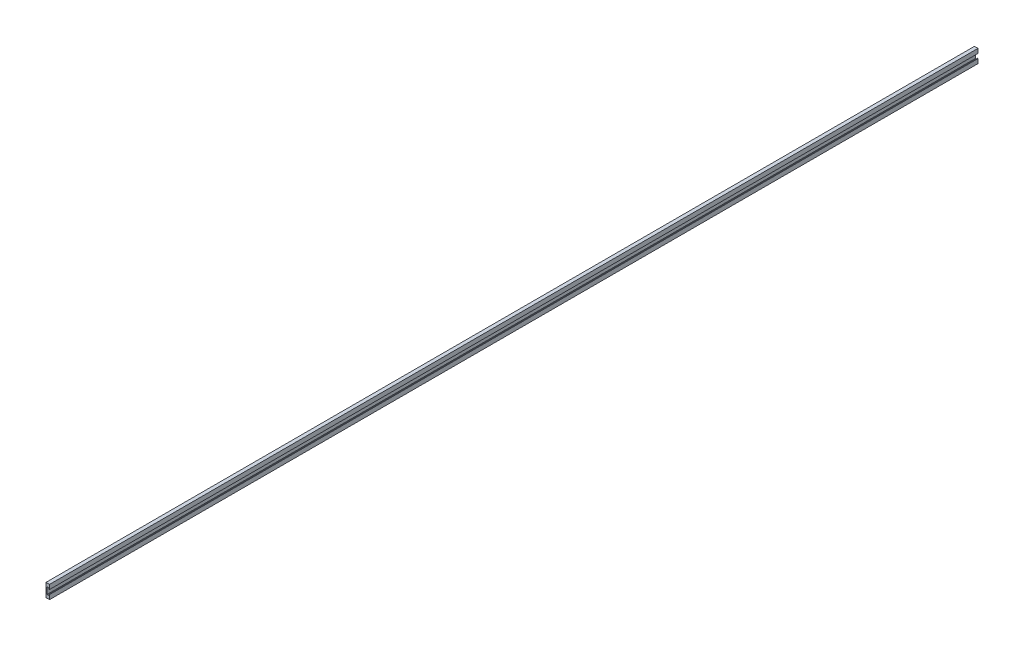
ISO-10303-21;
HEADER;
FILE_DESCRIPTION(('STEP AP214'),'2;1');
FILE_NAME('part.step','',(''),(''),'','','');
FILE_SCHEMA(('AUTOMOTIVE_DESIGN { 1 0 10303 214 1 1 1 1 }'));
ENDSEC;
DATA;
#1=APPLICATION_CONTEXT('core data for automotive mechanical design processes');
#2=APPLICATION_PROTOCOL_DEFINITION('international standard','automotive_design',2000,#1);
#3=PRODUCT_CONTEXT('',#1,'mechanical');
#4=PRODUCT('Part','Part','',(#3));
#5=PRODUCT_RELATED_PRODUCT_CATEGORY('part','',(#4));
#6=PRODUCT_DEFINITION_FORMATION('','',#4);
#7=PRODUCT_DEFINITION_CONTEXT('part definition',#1,'design');
#8=PRODUCT_DEFINITION('design','',#6,#7);
#9=PRODUCT_DEFINITION_SHAPE('','',#8);
#10=(LENGTH_UNIT() NAMED_UNIT(*) SI_UNIT(.MILLI.,.METRE.));
#11=(NAMED_UNIT(*) PLANE_ANGLE_UNIT() SI_UNIT($,.RADIAN.));
#12=(NAMED_UNIT(*) SI_UNIT($,.STERADIAN.) SOLID_ANGLE_UNIT());
#13=UNCERTAINTY_MEASURE_WITH_UNIT(LENGTH_MEASURE(1.E-05),#10,'distance_accuracy_value','');
#14=(GEOMETRIC_REPRESENTATION_CONTEXT(3) GLOBAL_UNCERTAINTY_ASSIGNED_CONTEXT((#13)) GLOBAL_UNIT_ASSIGNED_CONTEXT((#10,
#11,#12)) REPRESENTATION_CONTEXT('',''));
#15=CARTESIAN_POINT('',(0.,0.,0.));
#16=DIRECTION('',(0.,0.,1.));
#17=DIRECTION('',(1.,0.,0.));
#18=AXIS2_PLACEMENT_3D('',#15,#16,#17);
#19=CARTESIAN_POINT('',(0.,7.5,1050.));
#20=DIRECTION('',(-1.,0.,0.));
#21=DIRECTION('',(0.,-1.,0.));
#22=AXIS2_PLACEMENT_3D('',#19,#20,#21);
#23=PLANE('',#22);
#24=DIRECTION('',(0.,1.,0.));
#25=VECTOR('',#24,1.);
#26=CARTESIAN_POINT('',(0.,7.5,-1050.));
#27=LINE('',#26,#25);
#28=CARTESIAN_POINT('',(0.,0.,-1050.));
#29=VERTEX_POINT('',#28);
#30=CARTESIAN_POINT('',(0.,10.,-1050.));
#31=VERTEX_POINT('',#30);
#32=EDGE_CURVE('E97',#29,#31,#27,.T.);
#33=ORIENTED_EDGE('',*,*,#32,.T.);
#34=DIRECTION('',(0.,0.,-1.));
#35=VECTOR('',#34,1.);
#36=CARTESIAN_POINT('',(0.,10.,1050.));
#37=LINE('',#36,#35);
#38=CARTESIAN_POINT('',(0.,10.,1050.));
#39=VERTEX_POINT('',#38);
#40=EDGE_CURVE('E11',#39,#31,#37,.T.);
#41=ORIENTED_EDGE('',*,*,#40,.F.);
#42=DIRECTION('',(0.,1.,0.));
#43=VECTOR('',#42,1.);
#44=CARTESIAN_POINT('',(0.,7.5,1050.));
#45=LINE('',#44,#43);
#46=CARTESIAN_POINT('',(0.,0.,1050.));
#47=VERTEX_POINT('',#46);
#48=EDGE_CURVE('E103',#47,#39,#45,.T.);
#49=ORIENTED_EDGE('',*,*,#48,.F.);
#50=DIRECTION('',(0.,0.,-1.));
#51=VECTOR('',#50,1.);
#52=CARTESIAN_POINT('',(0.,0.,1050.));
#53=LINE('',#52,#51);
#54=EDGE_CURVE('E149',#47,#29,#53,.T.);
#55=ORIENTED_EDGE('',*,*,#54,.T.);
#56=EDGE_LOOP('',(#33,#41,#49,#55));
#57=FACE_BOUND('',#56,.T.);
#58=ADVANCED_FACE('F33',(#57),#23,.F.);
#59=CARTESIAN_POINT('',(0.,10.,1050.));
#60=DIRECTION('',(0.,-1.,0.));
#61=DIRECTION('',(0.,0.,-1.));
#62=AXIS2_PLACEMENT_3D('',#59,#60,#61);
#63=PLANE('',#62);
#64=DIRECTION('',(-1.,0.,0.));
#65=VECTOR('',#64,1.);
#66=CARTESIAN_POINT('',(0.,10.,-1050.));
#67=LINE('',#66,#65);
#68=CARTESIAN_POINT('',(-1.5,10.,-1050.));
#69=VERTEX_POINT('',#68);
#70=EDGE_CURVE('E154',#31,#69,#67,.T.);
#71=ORIENTED_EDGE('',*,*,#70,.T.);
#72=DIRECTION('',(0.,0.,-1.));
#73=VECTOR('',#72,1.);
#74=CARTESIAN_POINT('',(-1.5,10.,1050.));
#75=LINE('',#74,#73);
#76=CARTESIAN_POINT('',(-1.5,10.,1050.));
#77=VERTEX_POINT('',#76);
#78=EDGE_CURVE('E41',#77,#69,#75,.T.);
#79=ORIENTED_EDGE('',*,*,#78,.F.);
#80=DIRECTION('',(-1.,0.,0.));
#81=VECTOR('',#80,1.);
#82=CARTESIAN_POINT('',(0.,10.,1050.));
#83=LINE('',#82,#81);
#84=EDGE_CURVE('E242',#39,#77,#83,.T.);
#85=ORIENTED_EDGE('',*,*,#84,.F.);
#86=ORIENTED_EDGE('',*,*,#40,.T.);
#87=EDGE_LOOP('',(#71,#79,#85,#86));
#88=FACE_BOUND('',#87,.T.);
#89=ADVANCED_FACE('F245',(#88),#63,.F.);
#90=CARTESIAN_POINT('',(-1.5,10.,1050.));
#91=DIRECTION('',(1.,0.,0.));
#92=DIRECTION('',(0.,0.,-1.));
#93=AXIS2_PLACEMENT_3D('',#90,#91,#92);
#94=PLANE('',#93);
#95=DIRECTION('',(0.,-1.,0.));
#96=VECTOR('',#95,1.);
#97=CARTESIAN_POINT('',(-1.5,10.,-1050.));
#98=LINE('',#97,#96);
#99=CARTESIAN_POINT('',(-1.5,7.5,-1050.));
#100=VERTEX_POINT('',#99);
#101=EDGE_CURVE('E156',#69,#100,#98,.T.);
#102=ORIENTED_EDGE('',*,*,#101,.T.);
#103=DIRECTION('',(0.,0.,-1.));
#104=VECTOR('',#103,1.);
#105=CARTESIAN_POINT('',(-1.5,7.5,1050.));
#106=LINE('',#105,#104);
#107=CARTESIAN_POINT('',(-1.5,7.5,1050.));
#108=VERTEX_POINT('',#107);
#109=EDGE_CURVE('E194',#108,#100,#106,.T.);
#110=ORIENTED_EDGE('',*,*,#109,.F.);
#111=DIRECTION('',(0.,-1.,0.));
#112=VECTOR('',#111,1.);
#113=CARTESIAN_POINT('',(-1.5,10.,1050.));
#114=LINE('',#113,#112);
#115=EDGE_CURVE('E203',#77,#108,#114,.T.);
#116=ORIENTED_EDGE('',*,*,#115,.F.);
#117=ORIENTED_EDGE('',*,*,#78,.T.);
#118=EDGE_LOOP('',(#102,#110,#116,#117));
#119=FACE_BOUND('',#118,.T.);
#120=ADVANCED_FACE('F201',(#119),#94,.F.);
#121=CARTESIAN_POINT('',(-5.5,7.5,1050.));
#122=DIRECTION('',(0.,-1.,0.));
#123=DIRECTION('',(0.,0.,-1.));
#124=AXIS2_PLACEMENT_3D('',#121,#122,#123);
#125=PLANE('',#124);
#126=DIRECTION('',(-1.,0.,0.));
#127=VECTOR('',#126,1.);
#128=CARTESIAN_POINT('',(-5.5,7.5,-1050.));
#129=LINE('',#128,#127);
#130=CARTESIAN_POINT('',(-5.5,7.5,-1050.));
#131=VERTEX_POINT('',#130);
#132=EDGE_CURVE('E158',#100,#131,#129,.T.);
#133=ORIENTED_EDGE('',*,*,#132,.T.);
#134=DIRECTION('',(0.,0.,-1.));
#135=VECTOR('',#134,1.);
#136=CARTESIAN_POINT('',(-5.5,7.5,1050.));
#137=LINE('',#136,#135);
#138=CARTESIAN_POINT('',(-5.5,7.5,1050.));
#139=VERTEX_POINT('',#138);
#140=EDGE_CURVE('E191',#139,#131,#137,.T.);
#141=ORIENTED_EDGE('',*,*,#140,.F.);
#142=DIRECTION('',(-1.,0.,0.));
#143=VECTOR('',#142,1.);
#144=CARTESIAN_POINT('',(-5.5,7.5,1050.));
#145=LINE('',#144,#143);
#146=EDGE_CURVE('E221',#108,#139,#145,.T.);
#147=ORIENTED_EDGE('',*,*,#146,.F.);
#148=ORIENTED_EDGE('',*,*,#109,.T.);
#149=EDGE_LOOP('',(#133,#141,#147,#148));
#150=FACE_BOUND('',#149,.T.);
#151=ADVANCED_FACE('F212',(#150),#125,.F.);
#152=CARTESIAN_POINT('',(-5.5,22.5,1050.));
#153=DIRECTION('',(-1.,0.,0.));
#154=DIRECTION('',(0.,0.,1.));
#155=AXIS2_PLACEMENT_3D('',#152,#153,#154);
#156=PLANE('',#155);
#157=DIRECTION('',(0.,1.,0.));
#158=VECTOR('',#157,1.);
#159=CARTESIAN_POINT('',(-5.5,22.5,-1050.));
#160=LINE('',#159,#158);
#161=CARTESIAN_POINT('',(-5.5,22.5,-1050.));
#162=VERTEX_POINT('',#161);
#163=EDGE_CURVE('E160',#131,#162,#160,.T.);
#164=ORIENTED_EDGE('',*,*,#163,.T.);
#165=DIRECTION('',(0.,0.,-1.));
#166=VECTOR('',#165,1.);
#167=CARTESIAN_POINT('',(-5.5,22.5,1050.));
#168=LINE('',#167,#166);
#169=CARTESIAN_POINT('',(-5.5,22.5,1050.));
#170=VERTEX_POINT('',#169);
#171=EDGE_CURVE('E188',#170,#162,#168,.T.);
#172=ORIENTED_EDGE('',*,*,#171,.F.);
#173=DIRECTION('',(0.,1.,0.));
#174=VECTOR('',#173,1.);
#175=CARTESIAN_POINT('',(-5.5,22.5,1050.));
#176=LINE('',#175,#174);
#177=EDGE_CURVE('E218',#139,#170,#176,.T.);
#178=ORIENTED_EDGE('',*,*,#177,.F.);
#179=ORIENTED_EDGE('',*,*,#140,.T.);
#180=EDGE_LOOP('',(#164,#172,#178,#179));
#181=FACE_BOUND('',#180,.T.);
#182=ADVANCED_FACE('F216',(#181),#156,.F.);
#183=CARTESIAN_POINT('',(-1.5,22.5,1050.));
#184=DIRECTION('',(0.,1.,0.));
#185=DIRECTION('',(0.,0.,1.));
#186=AXIS2_PLACEMENT_3D('',#183,#184,#185);
#187=PLANE('',#186);
#188=DIRECTION('',(1.,0.,0.));
#189=VECTOR('',#188,1.);
#190=CARTESIAN_POINT('',(-1.5,22.5,-1050.));
#191=LINE('',#190,#189);
#192=CARTESIAN_POINT('',(-1.5,22.5,-1050.));
#193=VERTEX_POINT('',#192);
#194=EDGE_CURVE('E162',#162,#193,#191,.T.);
#195=ORIENTED_EDGE('',*,*,#194,.T.);
#196=DIRECTION('',(0.,0.,-1.));
#197=VECTOR('',#196,1.);
#198=CARTESIAN_POINT('',(-1.5,22.5,1050.));
#199=LINE('',#198,#197);
#200=CARTESIAN_POINT('',(-1.5,22.5,1050.));
#201=VERTEX_POINT('',#200);
#202=EDGE_CURVE('E185',#201,#193,#199,.T.);
#203=ORIENTED_EDGE('',*,*,#202,.F.);
#204=DIRECTION('',(1.,0.,0.));
#205=VECTOR('',#204,1.);
#206=CARTESIAN_POINT('',(-1.5,22.5,1050.));
#207=LINE('',#206,#205);
#208=EDGE_CURVE('E220',#170,#201,#207,.T.);
#209=ORIENTED_EDGE('',*,*,#208,.F.);
#210=ORIENTED_EDGE('',*,*,#171,.T.);
#211=EDGE_LOOP('',(#195,#203,#209,#210));
#212=FACE_BOUND('',#211,.T.);
#213=ADVANCED_FACE('F257',(#212),#187,.F.);
#214=CARTESIAN_POINT('',(-1.5,20.,1050.));
#215=DIRECTION('',(1.,0.,0.));
#216=DIRECTION('',(0.,0.,-1.));
#217=AXIS2_PLACEMENT_3D('',#214,#215,#216);
#218=PLANE('',#217);
#219=DIRECTION('',(0.,-1.,0.));
#220=VECTOR('',#219,1.);
#221=CARTESIAN_POINT('',(-1.5,20.,-1050.));
#222=LINE('',#221,#220);
#223=CARTESIAN_POINT('',(-1.5,20.,-1050.));
#224=VERTEX_POINT('',#223);
#225=EDGE_CURVE('E164',#193,#224,#222,.T.);
#226=ORIENTED_EDGE('',*,*,#225,.T.);
#227=DIRECTION('',(0.,0.,-1.));
#228=VECTOR('',#227,1.);
#229=CARTESIAN_POINT('',(-1.5,20.,1050.));
#230=LINE('',#229,#228);
#231=CARTESIAN_POINT('',(-1.5,20.,1050.));
#232=VERTEX_POINT('',#231);
#233=EDGE_CURVE('E182',#232,#224,#230,.T.);
#234=ORIENTED_EDGE('',*,*,#233,.F.);
#235=DIRECTION('',(0.,-1.,0.));
#236=VECTOR('',#235,1.);
#237=CARTESIAN_POINT('',(-1.5,20.,1050.));
#238=LINE('',#237,#236);
#239=EDGE_CURVE('E223',#201,#232,#238,.T.);
#240=ORIENTED_EDGE('',*,*,#239,.F.);
#241=ORIENTED_EDGE('',*,*,#202,.T.);
#242=EDGE_LOOP('',(#226,#234,#240,#241));
#243=FACE_BOUND('',#242,.T.);
#244=ADVANCED_FACE('F260',(#243),#218,.F.);
#245=CARTESIAN_POINT('',(0.,20.,1050.));
#246=DIRECTION('',(0.,1.,0.));
#247=DIRECTION('',(0.,0.,1.));
#248=AXIS2_PLACEMENT_3D('',#245,#246,#247);
#249=PLANE('',#248);
#250=DIRECTION('',(1.,0.,0.));
#251=VECTOR('',#250,1.);
#252=CARTESIAN_POINT('',(0.,20.,-1050.));
#253=LINE('',#252,#251);
#254=CARTESIAN_POINT('',(0.,20.,-1050.));
#255=VERTEX_POINT('',#254);
#256=EDGE_CURVE('E166',#224,#255,#253,.T.);
#257=ORIENTED_EDGE('',*,*,#256,.T.);
#258=DIRECTION('',(0.,0.,-1.));
#259=VECTOR('',#258,1.);
#260=CARTESIAN_POINT('',(0.,20.,1050.));
#261=LINE('',#260,#259);
#262=CARTESIAN_POINT('',(0.,20.,1050.));
#263=VERTEX_POINT('',#262);
#264=EDGE_CURVE('E179',#263,#255,#261,.T.);
#265=ORIENTED_EDGE('',*,*,#264,.F.);
#266=DIRECTION('',(1.,0.,0.));
#267=VECTOR('',#266,1.);
#268=CARTESIAN_POINT('',(0.,20.,1050.));
#269=LINE('',#268,#267);
#270=EDGE_CURVE('E229',#232,#263,#269,.T.);
#271=ORIENTED_EDGE('',*,*,#270,.F.);
#272=ORIENTED_EDGE('',*,*,#233,.T.);
#273=EDGE_LOOP('',(#257,#265,#271,#272));
#274=FACE_BOUND('',#273,.T.);
#275=ADVANCED_FACE('F235',(#274),#249,.F.);
#276=CARTESIAN_POINT('',(0.,30.,1050.));
#277=DIRECTION('',(-1.,0.,0.));
#278=DIRECTION('',(0.,-1.,0.));
#279=AXIS2_PLACEMENT_3D('',#276,#277,#278);
#280=PLANE('',#279);
#281=DIRECTION('',(0.,1.,0.));
#282=VECTOR('',#281,1.);
#283=CARTESIAN_POINT('',(0.,30.,-1050.));
#284=LINE('',#283,#282);
#285=CARTESIAN_POINT('',(0.,30.,-1050.));
#286=VERTEX_POINT('',#285);
#287=EDGE_CURVE('E169',#255,#286,#284,.T.);
#288=ORIENTED_EDGE('',*,*,#287,.T.);
#289=DIRECTION('',(0.,0.,-1.));
#290=VECTOR('',#289,1.);
#291=CARTESIAN_POINT('',(0.,30.,1050.));
#292=LINE('',#291,#290);
#293=CARTESIAN_POINT('',(0.,30.,1050.));
#294=VERTEX_POINT('',#293);
#295=EDGE_CURVE('E144',#294,#286,#292,.T.);
#296=ORIENTED_EDGE('',*,*,#295,.F.);
#297=DIRECTION('',(0.,1.,0.));
#298=VECTOR('',#297,1.);
#299=CARTESIAN_POINT('',(0.,22.5,1050.));
#300=LINE('',#299,#298);
#301=EDGE_CURVE('E135',#263,#294,#300,.T.);
#302=ORIENTED_EDGE('',*,*,#301,.F.);
#303=ORIENTED_EDGE('',*,*,#264,.T.);
#304=EDGE_LOOP('',(#288,#296,#302,#303));
#305=FACE_BOUND('',#304,.T.);
#306=ADVANCED_FACE('F238',(#305),#280,.F.);
#307=CARTESIAN_POINT('',(-8.,30.,1050.));
#308=DIRECTION('',(0.,-1.,0.));
#309=DIRECTION('',(0.,0.,-1.));
#310=AXIS2_PLACEMENT_3D('',#307,#308,#309);
#311=PLANE('',#310);
#312=DIRECTION('',(-1.,0.,0.));
#313=VECTOR('',#312,1.);
#314=CARTESIAN_POINT('',(-8.,30.,-1050.));
#315=LINE('',#314,#313);
#316=CARTESIAN_POINT('',(-8.,30.,-1050.));
#317=VERTEX_POINT('',#316);
#318=EDGE_CURVE('E143',#286,#317,#315,.T.);
#319=ORIENTED_EDGE('',*,*,#318,.T.);
#320=DIRECTION('',(0.,0.,-1.));
#321=VECTOR('',#320,1.);
#322=CARTESIAN_POINT('',(-8.,30.,1050.));
#323=LINE('',#322,#321);
#324=CARTESIAN_POINT('',(-8.,30.,1050.));
#325=VERTEX_POINT('',#324);
#326=EDGE_CURVE('E140',#325,#317,#323,.T.);
#327=ORIENTED_EDGE('',*,*,#326,.F.);
#328=DIRECTION('',(-1.,0.,0.));
#329=VECTOR('',#328,1.);
#330=CARTESIAN_POINT('',(-8.,30.,1050.));
#331=LINE('',#330,#329);
#332=EDGE_CURVE('E129',#294,#325,#331,.T.);
#333=ORIENTED_EDGE('',*,*,#332,.F.);
#334=ORIENTED_EDGE('',*,*,#295,.T.);
#335=EDGE_LOOP('',(#319,#327,#333,#334));
#336=FACE_BOUND('',#335,.T.);
#337=ADVANCED_FACE('F141',(#336),#311,.F.);
#338=CARTESIAN_POINT('',(-8.,0.,1050.));
#339=DIRECTION('',(1.,0.,0.));
#340=DIRECTION('',(0.,0.,-1.));
#341=AXIS2_PLACEMENT_3D('',#338,#339,#340);
#342=PLANE('',#341);
#343=DIRECTION('',(0.,-1.,0.));
#344=VECTOR('',#343,1.);
#345=CARTESIAN_POINT('',(-8.,0.,-1050.));
#346=LINE('',#345,#344);
#347=CARTESIAN_POINT('',(-8.,0.,-1050.));
#348=VERTEX_POINT('',#347);
#349=EDGE_CURVE('E90',#317,#348,#346,.T.);
#350=ORIENTED_EDGE('',*,*,#349,.T.);
#351=DIRECTION('',(0.,0.,-1.));
#352=VECTOR('',#351,1.);
#353=CARTESIAN_POINT('',(-8.,0.,1050.));
#354=LINE('',#353,#352);
#355=CARTESIAN_POINT('',(-8.,0.,1050.));
#356=VERTEX_POINT('',#355);
#357=EDGE_CURVE('E145',#356,#348,#354,.T.);
#358=ORIENTED_EDGE('',*,*,#357,.F.);
#359=DIRECTION('',(0.,-1.,0.));
#360=VECTOR('',#359,1.);
#361=CARTESIAN_POINT('',(-8.,0.,1050.));
#362=LINE('',#361,#360);
#363=EDGE_CURVE('E133',#325,#356,#362,.T.);
#364=ORIENTED_EDGE('',*,*,#363,.F.);
#365=ORIENTED_EDGE('',*,*,#326,.T.);
#366=EDGE_LOOP('',(#350,#358,#364,#365));
#367=FACE_BOUND('',#366,.T.);
#368=ADVANCED_FACE('F147',(#367),#342,.F.);
#369=CARTESIAN_POINT('',(0.,0.,1050.));
#370=DIRECTION('',(0.,1.,0.));
#371=DIRECTION('',(0.,0.,1.));
#372=AXIS2_PLACEMENT_3D('',#369,#370,#371);
#373=PLANE('',#372);
#374=DIRECTION('',(1.,0.,0.));
#375=VECTOR('',#374,1.);
#376=CARTESIAN_POINT('',(0.,0.,-1050.));
#377=LINE('',#376,#375);
#378=EDGE_CURVE('E173',#348,#29,#377,.T.);
#379=ORIENTED_EDGE('',*,*,#378,.T.);
#380=ORIENTED_EDGE('',*,*,#54,.F.);
#381=DIRECTION('',(1.,0.,0.));
#382=VECTOR('',#381,1.);
#383=CARTESIAN_POINT('',(0.,0.,1050.));
#384=LINE('',#383,#382);
#385=EDGE_CURVE('E49',#356,#47,#384,.T.);
#386=ORIENTED_EDGE('',*,*,#385,.F.);
#387=ORIENTED_EDGE('',*,*,#357,.T.);
#388=EDGE_LOOP('',(#379,#380,#386,#387));
#389=FACE_BOUND('',#388,.T.);
#390=ADVANCED_FACE('F240',(#389),#373,.F.);
#391=CARTESIAN_POINT('',(0.,0.,1050.));
#392=DIRECTION('',(0.,0.,-1.));
#393=DIRECTION('',(-1.,0.,0.));
#394=AXIS2_PLACEMENT_3D('',#391,#392,#393);
#395=PLANE('',#394);
#396=ORIENTED_EDGE('',*,*,#48,.T.);
#397=ORIENTED_EDGE('',*,*,#84,.T.);
#398=ORIENTED_EDGE('',*,*,#115,.T.);
#399=ORIENTED_EDGE('',*,*,#146,.T.);
#400=ORIENTED_EDGE('',*,*,#177,.T.);
#401=ORIENTED_EDGE('',*,*,#208,.T.);
#402=ORIENTED_EDGE('',*,*,#239,.T.);
#403=ORIENTED_EDGE('',*,*,#270,.T.);
#404=ORIENTED_EDGE('',*,*,#301,.T.);
#405=ORIENTED_EDGE('',*,*,#332,.T.);
#406=ORIENTED_EDGE('',*,*,#363,.T.);
#407=ORIENTED_EDGE('',*,*,#385,.T.);
#408=EDGE_LOOP('',(#396,#397,#398,#399,#400,#401,#402,#403,#404,#405,#406,#407));
#409=FACE_BOUND('',#408,.T.);
#410=ADVANCED_FACE('F131',(#409),#395,.F.);
#411=CARTESIAN_POINT('',(0.,0.,-1050.));
#412=DIRECTION('',(0.,0.,-1.));
#413=DIRECTION('',(-1.,0.,0.));
#414=AXIS2_PLACEMENT_3D('',#411,#412,#413);
#415=PLANE('',#414);
#416=ORIENTED_EDGE('',*,*,#32,.F.);
#417=ORIENTED_EDGE('',*,*,#378,.F.);
#418=ORIENTED_EDGE('',*,*,#349,.F.);
#419=ORIENTED_EDGE('',*,*,#318,.F.);
#420=ORIENTED_EDGE('',*,*,#287,.F.);
#421=ORIENTED_EDGE('',*,*,#256,.F.);
#422=ORIENTED_EDGE('',*,*,#225,.F.);
#423=ORIENTED_EDGE('',*,*,#194,.F.);
#424=ORIENTED_EDGE('',*,*,#163,.F.);
#425=ORIENTED_EDGE('',*,*,#132,.F.);
#426=ORIENTED_EDGE('',*,*,#101,.F.);
#427=ORIENTED_EDGE('',*,*,#70,.F.);
#428=EDGE_LOOP('',(#416,#417,#418,#419,#420,#421,#422,#423,#424,#425,#426,#427));
#429=FACE_BOUND('',#428,.T.);
#430=ADVANCED_FACE('F207',(#429),#415,.T.);
#431=CLOSED_SHELL('',(#58,#89,#120,#151,#182,#213,#244,#275,#306,#337,#368,#390,#410,#430));
#432=MANIFOLD_SOLID_BREP('B2',#431);
#433=ADVANCED_BREP_SHAPE_REPRESENTATION('',(#18,#432),#14);
#434=SHAPE_DEFINITION_REPRESENTATION(#9,#433);
ENDSEC;
END-ISO-10303-21;
